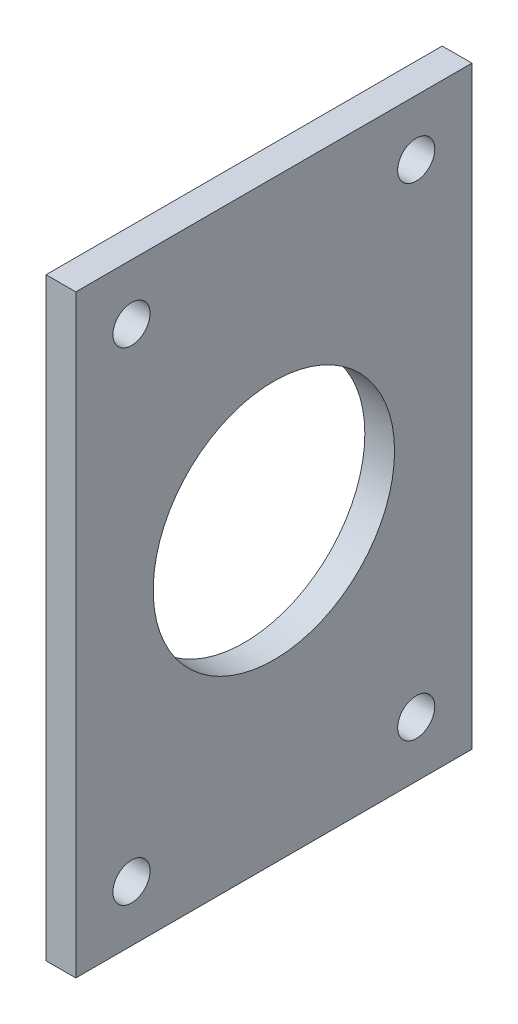
ISO-10303-21;
HEADER;
FILE_DESCRIPTION(('STEP AP214'),'2;1');
FILE_NAME('part.step','',(''),(''),'','','');
FILE_SCHEMA(('AUTOMOTIVE_DESIGN { 1 0 10303 214 1 1 1 1 }'));
ENDSEC;
DATA;
#1=APPLICATION_CONTEXT('core data for automotive mechanical design processes');
#2=APPLICATION_PROTOCOL_DEFINITION('international standard','automotive_design',2000,#1);
#3=PRODUCT_CONTEXT('',#1,'mechanical');
#4=PRODUCT('Part','Part','',(#3));
#5=PRODUCT_RELATED_PRODUCT_CATEGORY('part','',(#4));
#6=PRODUCT_DEFINITION_FORMATION('','',#4);
#7=PRODUCT_DEFINITION_CONTEXT('part definition',#1,'design');
#8=PRODUCT_DEFINITION('design','',#6,#7);
#9=PRODUCT_DEFINITION_SHAPE('','',#8);
#10=(LENGTH_UNIT() NAMED_UNIT(*) SI_UNIT(.MILLI.,.METRE.));
#11=(NAMED_UNIT(*) PLANE_ANGLE_UNIT() SI_UNIT($,.RADIAN.));
#12=(NAMED_UNIT(*) SI_UNIT($,.STERADIAN.) SOLID_ANGLE_UNIT());
#13=UNCERTAINTY_MEASURE_WITH_UNIT(LENGTH_MEASURE(1.E-05),#10,'distance_accuracy_value','');
#14=(GEOMETRIC_REPRESENTATION_CONTEXT(3) GLOBAL_UNCERTAINTY_ASSIGNED_CONTEXT((#13)) GLOBAL_UNIT_ASSIGNED_CONTEXT((#10,
#11,#12)) REPRESENTATION_CONTEXT('',''));
#15=CARTESIAN_POINT('',(0.,0.,0.));
#16=DIRECTION('',(0.,0.,1.));
#17=DIRECTION('',(1.,0.,0.));
#18=AXIS2_PLACEMENT_3D('',#15,#16,#17);
#19=CARTESIAN_POINT('',(0.,0.,16.));
#20=DIRECTION('',(0.,0.,1.));
#21=DIRECTION('',(1.,0.,0.));
#22=AXIS2_PLACEMENT_3D('',#19,#20,#21);
#23=PLANE('',#22);
#24=DIRECTION('',(-1.,0.,0.));
#25=VECTOR('',#24,1.);
#26=CARTESIAN_POINT('',(0.,-24.,16.));
#27=LINE('',#26,#25);
#28=CARTESIAN_POINT('',(1.2,-24.,16.));
#29=VERTEX_POINT('',#28);
#30=CARTESIAN_POINT('',(-1.2,-24.,16.));
#31=VERTEX_POINT('',#30);
#32=EDGE_CURVE('E293',#29,#31,#27,.T.);
#33=ORIENTED_EDGE('',*,*,#32,.F.);
#34=DIRECTION('',(0.,-1.,0.));
#35=VECTOR('',#34,1.);
#36=CARTESIAN_POINT('',(1.2,0.,16.));
#37=LINE('',#36,#35);
#38=CARTESIAN_POINT('',(1.2,24.,16.));
#39=VERTEX_POINT('',#38);
#40=EDGE_CURVE('E286',#39,#29,#37,.T.);
#41=ORIENTED_EDGE('',*,*,#40,.F.);
#42=DIRECTION('',(1.,0.,0.));
#43=VECTOR('',#42,1.);
#44=CARTESIAN_POINT('',(0.,24.,16.));
#45=LINE('',#44,#43);
#46=CARTESIAN_POINT('',(-1.2,24.,16.));
#47=VERTEX_POINT('',#46);
#48=EDGE_CURVE('E287',#47,#39,#45,.T.);
#49=ORIENTED_EDGE('',*,*,#48,.F.);
#50=DIRECTION('',(0.,1.,0.));
#51=VECTOR('',#50,1.);
#52=CARTESIAN_POINT('',(-1.2,0.,16.));
#53=LINE('',#52,#51);
#54=EDGE_CURVE('E295',#31,#47,#53,.T.);
#55=ORIENTED_EDGE('',*,*,#54,.F.);
#56=EDGE_LOOP('',(#33,#41,#49,#55));
#57=FACE_BOUND('',#56,.T.);
#58=ADVANCED_FACE('F15',(#57),#23,.T.);
#59=CARTESIAN_POINT('',(0.,-24.,-16.));
#60=DIRECTION('',(0.,-1.,0.));
#61=DIRECTION('',(0.,0.,-1.));
#62=AXIS2_PLACEMENT_3D('',#59,#60,#61);
#63=PLANE('',#62);
#64=DIRECTION('',(0.,0.,1.));
#65=VECTOR('',#64,1.);
#66=CARTESIAN_POINT('',(1.2,-24.,-16.));
#67=LINE('',#66,#65);
#68=CARTESIAN_POINT('',(1.2,-24.,-16.));
#69=VERTEX_POINT('',#68);
#70=EDGE_CURVE('E267',#69,#29,#67,.T.);
#71=ORIENTED_EDGE('',*,*,#70,.T.);
#72=ORIENTED_EDGE('',*,*,#32,.T.);
#73=DIRECTION('',(0.,0.,1.));
#74=VECTOR('',#73,1.);
#75=CARTESIAN_POINT('',(-1.2,-24.,-16.));
#76=LINE('',#75,#74);
#77=CARTESIAN_POINT('',(-1.2,-24.,-16.));
#78=VERTEX_POINT('',#77);
#79=EDGE_CURVE('E284',#78,#31,#76,.T.);
#80=ORIENTED_EDGE('',*,*,#79,.F.);
#81=DIRECTION('',(1.,0.,0.));
#82=VECTOR('',#81,1.);
#83=CARTESIAN_POINT('',(0.,-24.,-16.));
#84=LINE('',#83,#82);
#85=EDGE_CURVE('E265',#78,#69,#84,.T.);
#86=ORIENTED_EDGE('',*,*,#85,.T.);
#87=EDGE_LOOP('',(#71,#72,#80,#86));
#88=FACE_BOUND('',#87,.T.);
#89=ADVANCED_FACE('F363',(#88),#63,.T.);
#90=CARTESIAN_POINT('',(-1.2,0.,-16.));
#91=DIRECTION('',(-1.,0.,0.));
#92=DIRECTION('',(0.,0.,1.));
#93=AXIS2_PLACEMENT_3D('',#90,#91,#92);
#94=PLANE('',#93);
#95=DIRECTION('',(0.,1.,0.));
#96=VECTOR('',#95,1.);
#97=CARTESIAN_POINT('',(-1.2,0.,13.5));
#98=LINE('',#97,#96);
#99=CARTESIAN_POINT('',(-1.2,-4.,13.5));
#100=VERTEX_POINT('',#99);
#101=CARTESIAN_POINT('',(-1.2,4.,13.5));
#102=VERTEX_POINT('',#101);
#103=EDGE_CURVE('E10',#100,#102,#98,.T.);
#104=ORIENTED_EDGE('',*,*,#103,.F.);
#105=DIRECTION('',(0.,0.,1.));
#106=VECTOR('',#105,1.);
#107=CARTESIAN_POINT('',(-1.2,-4.,-16.));
#108=LINE('',#107,#106);
#109=CARTESIAN_POINT('',(-1.2,-4.,12.3));
#110=VERTEX_POINT('',#109);
#111=EDGE_CURVE('E22',#110,#100,#108,.T.);
#112=ORIENTED_EDGE('',*,*,#111,.F.);
#113=DIRECTION('',(0.,-1.,0.));
#114=VECTOR('',#113,1.);
#115=CARTESIAN_POINT('',(-1.2,0.,12.3));
#116=LINE('',#115,#114);
#117=CARTESIAN_POINT('',(-1.2,4.,12.3));
#118=VERTEX_POINT('',#117);
#119=EDGE_CURVE('E341',#118,#110,#116,.T.);
#120=ORIENTED_EDGE('',*,*,#119,.F.);
#121=DIRECTION('',(0.,0.,-1.));
#122=VECTOR('',#121,1.);
#123=CARTESIAN_POINT('',(-1.2,4.,-16.));
#124=LINE('',#123,#122);
#125=EDGE_CURVE('E32',#102,#118,#124,.T.);
#126=ORIENTED_EDGE('',*,*,#125,.F.);
#127=EDGE_LOOP('',(#104,#112,#120,#126));
#128=FACE_BOUND('',#127,.T.);
#129=DIRECTION('',(0.,1.,0.));
#130=VECTOR('',#129,1.);
#131=CARTESIAN_POINT('',(-1.2,0.,4.));
#132=LINE('',#131,#130);
#133=CARTESIAN_POINT('',(-1.2,20.3,4.));
#134=VERTEX_POINT('',#133);
#135=CARTESIAN_POINT('',(-1.2,21.5,4.));
#136=VERTEX_POINT('',#135);
#137=EDGE_CURVE('E339',#134,#136,#132,.T.);
#138=ORIENTED_EDGE('',*,*,#137,.F.);
#139=DIRECTION('',(0.,0.,1.));
#140=VECTOR('',#139,1.);
#141=CARTESIAN_POINT('',(-1.2,20.3,-16.));
#142=LINE('',#141,#140);
#143=CARTESIAN_POINT('',(-1.2,20.3,-4.));
#144=VERTEX_POINT('',#143);
#145=EDGE_CURVE('E333',#144,#134,#142,.T.);
#146=ORIENTED_EDGE('',*,*,#145,.F.);
#147=DIRECTION('',(0.,-1.,0.));
#148=VECTOR('',#147,1.);
#149=CARTESIAN_POINT('',(-1.2,0.,-4.));
#150=LINE('',#149,#148);
#151=CARTESIAN_POINT('',(-1.2,21.5,-4.));
#152=VERTEX_POINT('',#151);
#153=EDGE_CURVE('E328',#152,#144,#150,.T.);
#154=ORIENTED_EDGE('',*,*,#153,.F.);
#155=DIRECTION('',(0.,0.,-1.));
#156=VECTOR('',#155,1.);
#157=CARTESIAN_POINT('',(-1.2,21.5,-16.));
#158=LINE('',#157,#156);
#159=EDGE_CURVE('E335',#136,#152,#158,.T.);
#160=ORIENTED_EDGE('',*,*,#159,.F.);
#161=EDGE_LOOP('',(#138,#146,#154,#160));
#162=FACE_BOUND('',#161,.T.);
#163=DIRECTION('',(0.,1.,0.));
#164=VECTOR('',#163,1.);
#165=CARTESIAN_POINT('',(-1.2,0.,-12.3));
#166=LINE('',#165,#164);
#167=CARTESIAN_POINT('',(-1.2,-4.,-12.3));
#168=VERTEX_POINT('',#167);
#169=CARTESIAN_POINT('',(-1.2,4.,-12.3));
#170=VERTEX_POINT('',#169);
#171=EDGE_CURVE('E326',#168,#170,#166,.T.);
#172=ORIENTED_EDGE('',*,*,#171,.F.);
#173=DIRECTION('',(0.,0.,1.));
#174=VECTOR('',#173,1.);
#175=CARTESIAN_POINT('',(-1.2,-4.,-16.));
#176=LINE('',#175,#174);
#177=CARTESIAN_POINT('',(-1.2,-4.,-13.5));
#178=VERTEX_POINT('',#177);
#179=EDGE_CURVE('E323',#178,#168,#176,.T.);
#180=ORIENTED_EDGE('',*,*,#179,.F.);
#181=DIRECTION('',(0.,-1.,0.));
#182=VECTOR('',#181,1.);
#183=CARTESIAN_POINT('',(-1.2,0.,-13.5));
#184=LINE('',#183,#182);
#185=CARTESIAN_POINT('',(-1.2,4.,-13.5));
#186=VERTEX_POINT('',#185);
#187=EDGE_CURVE('E320',#186,#178,#184,.T.);
#188=ORIENTED_EDGE('',*,*,#187,.F.);
#189=DIRECTION('',(0.,0.,-1.));
#190=VECTOR('',#189,1.);
#191=CARTESIAN_POINT('',(-1.2,4.,-16.));
#192=LINE('',#191,#190);
#193=EDGE_CURVE('E319',#170,#186,#192,.T.);
#194=ORIENTED_EDGE('',*,*,#193,.F.);
#195=EDGE_LOOP('',(#172,#180,#188,#194));
#196=FACE_BOUND('',#195,.T.);
#197=DIRECTION('',(0.,1.,0.));
#198=VECTOR('',#197,1.);
#199=CARTESIAN_POINT('',(-1.2,0.,4.));
#200=LINE('',#199,#198);
#201=CARTESIAN_POINT('',(-1.2,-21.5,4.));
#202=VERTEX_POINT('',#201);
#203=CARTESIAN_POINT('',(-1.2,-20.3,4.));
#204=VERTEX_POINT('',#203);
#205=EDGE_CURVE('E314',#202,#204,#200,.T.);
#206=ORIENTED_EDGE('',*,*,#205,.F.);
#207=DIRECTION('',(0.,0.,1.));
#208=VECTOR('',#207,1.);
#209=CARTESIAN_POINT('',(-1.2,-21.5,-16.));
#210=LINE('',#209,#208);
#211=CARTESIAN_POINT('',(-1.2,-21.5,-4.));
#212=VERTEX_POINT('',#211);
#213=EDGE_CURVE('E313',#212,#202,#210,.T.);
#214=ORIENTED_EDGE('',*,*,#213,.F.);
#215=DIRECTION('',(0.,-1.,0.));
#216=VECTOR('',#215,1.);
#217=CARTESIAN_POINT('',(-1.2,0.,-4.));
#218=LINE('',#217,#216);
#219=CARTESIAN_POINT('',(-1.2,-20.3,-4.));
#220=VERTEX_POINT('',#219);
#221=EDGE_CURVE('E294',#220,#212,#218,.T.);
#222=ORIENTED_EDGE('',*,*,#221,.F.);
#223=DIRECTION('',(0.,0.,-1.));
#224=VECTOR('',#223,1.);
#225=CARTESIAN_POINT('',(-1.2,-20.3,-16.));
#226=LINE('',#225,#224);
#227=EDGE_CURVE('E306',#204,#220,#226,.T.);
#228=ORIENTED_EDGE('',*,*,#227,.F.);
#229=EDGE_LOOP('',(#206,#214,#222,#228));
#230=FACE_BOUND('',#229,.T.);
#231=CARTESIAN_POINT('',(-1.2,19.5,11.5));
#232=DIRECTION('',(-1.,0.,0.));
#233=DIRECTION('',(0.,0.,1.));
#234=AXIS2_PLACEMENT_3D('',#231,#232,#233);
#235=CIRCLE('',#234,1.5);
#236=CARTESIAN_POINT('',(-1.2,19.5,13.));
#237=VERTEX_POINT('',#236);
#238=EDGE_CURVE('E242',#237,#237,#235,.T.);
#239=ORIENTED_EDGE('',*,*,#238,.F.);
#240=EDGE_LOOP('',(#239));
#241=FACE_BOUND('',#240,.T.);
#242=CARTESIAN_POINT('',(-1.2,19.5,-11.5));
#243=DIRECTION('',(-1.,0.,0.));
#244=DIRECTION('',(0.,0.,1.));
#245=AXIS2_PLACEMENT_3D('',#242,#243,#244);
#246=CIRCLE('',#245,1.5);
#247=CARTESIAN_POINT('',(-1.2,19.5,-10.));
#248=VERTEX_POINT('',#247);
#249=EDGE_CURVE('E250',#248,#248,#246,.T.);
#250=ORIENTED_EDGE('',*,*,#249,.F.);
#251=EDGE_LOOP('',(#250));
#252=FACE_BOUND('',#251,.T.);
#253=CARTESIAN_POINT('',(-1.2,-19.5,11.5));
#254=DIRECTION('',(-1.,0.,0.));
#255=DIRECTION('',(0.,0.,1.));
#256=AXIS2_PLACEMENT_3D('',#253,#254,#255);
#257=CIRCLE('',#256,1.5);
#258=CARTESIAN_POINT('',(-1.2,-19.5,13.));
#259=VERTEX_POINT('',#258);
#260=EDGE_CURVE('E253',#259,#259,#257,.T.);
#261=ORIENTED_EDGE('',*,*,#260,.F.);
#262=EDGE_LOOP('',(#261));
#263=FACE_BOUND('',#262,.T.);
#264=CARTESIAN_POINT('',(-1.2,-19.5,-11.5));
#265=DIRECTION('',(-1.,0.,0.));
#266=DIRECTION('',(0.,0.,1.));
#267=AXIS2_PLACEMENT_3D('',#264,#265,#266);
#268=CIRCLE('',#267,1.5);
#269=CARTESIAN_POINT('',(-1.2,-19.5,-10.));
#270=VERTEX_POINT('',#269);
#271=EDGE_CURVE('E254',#270,#270,#268,.T.);
#272=ORIENTED_EDGE('',*,*,#271,.F.);
#273=EDGE_LOOP('',(#272));
#274=FACE_BOUND('',#273,.T.);
#275=CARTESIAN_POINT('',(-1.2,0.,0.));
#276=DIRECTION('',(-1.,0.,0.));
#277=DIRECTION('',(0.,0.,1.));
#278=AXIS2_PLACEMENT_3D('',#275,#276,#277);
#279=CIRCLE('',#278,9.75);
#280=CARTESIAN_POINT('',(-1.2,0.,9.75));
#281=VERTEX_POINT('',#280);
#282=EDGE_CURVE('E259',#281,#281,#279,.T.);
#283=ORIENTED_EDGE('',*,*,#282,.F.);
#284=EDGE_LOOP('',(#283));
#285=FACE_BOUND('',#284,.T.);
#286=ORIENTED_EDGE('',*,*,#79,.T.);
#287=ORIENTED_EDGE('',*,*,#54,.T.);
#288=DIRECTION('',(0.,0.,1.));
#289=VECTOR('',#288,1.);
#290=CARTESIAN_POINT('',(-1.2,24.,-16.));
#291=LINE('',#290,#289);
#292=CARTESIAN_POINT('',(-1.2,24.,-16.));
#293=VERTEX_POINT('',#292);
#294=EDGE_CURVE('E278',#293,#47,#291,.T.);
#295=ORIENTED_EDGE('',*,*,#294,.F.);
#296=DIRECTION('',(0.,-1.,0.));
#297=VECTOR('',#296,1.);
#298=CARTESIAN_POINT('',(-1.2,0.,-16.));
#299=LINE('',#298,#297);
#300=EDGE_CURVE('E264',#293,#78,#299,.T.);
#301=ORIENTED_EDGE('',*,*,#300,.T.);
#302=EDGE_LOOP('',(#286,#287,#295,#301));
#303=FACE_BOUND('',#302,.T.);
#304=ADVANCED_FACE('F368',(#128,#162,#196,#230,#241,#252,#263,#274,#285,#303),#94,.T.);
#305=CARTESIAN_POINT('',(0.,24.,-16.));
#306=DIRECTION('',(0.,1.,0.));
#307=DIRECTION('',(0.,0.,1.));
#308=AXIS2_PLACEMENT_3D('',#305,#306,#307);
#309=PLANE('',#308);
#310=ORIENTED_EDGE('',*,*,#294,.T.);
#311=ORIENTED_EDGE('',*,*,#48,.T.);
#312=DIRECTION('',(0.,0.,1.));
#313=VECTOR('',#312,1.);
#314=CARTESIAN_POINT('',(1.2,24.,-16.));
#315=LINE('',#314,#313);
#316=CARTESIAN_POINT('',(1.2,24.,-16.));
#317=VERTEX_POINT('',#316);
#318=EDGE_CURVE('E280',#317,#39,#315,.T.);
#319=ORIENTED_EDGE('',*,*,#318,.F.);
#320=DIRECTION('',(-1.,0.,0.));
#321=VECTOR('',#320,1.);
#322=CARTESIAN_POINT('',(0.,24.,-16.));
#323=LINE('',#322,#321);
#324=EDGE_CURVE('E269',#317,#293,#323,.T.);
#325=ORIENTED_EDGE('',*,*,#324,.T.);
#326=EDGE_LOOP('',(#310,#311,#319,#325));
#327=FACE_BOUND('',#326,.T.);
#328=ADVANCED_FACE('F379',(#327),#309,.T.);
#329=CARTESIAN_POINT('',(0.,0.,-16.));
#330=DIRECTION('',(0.,0.,-1.));
#331=DIRECTION('',(-1.,0.,0.));
#332=AXIS2_PLACEMENT_3D('',#329,#330,#331);
#333=PLANE('',#332);
#334=DIRECTION('',(0.,1.,0.));
#335=VECTOR('',#334,1.);
#336=CARTESIAN_POINT('',(1.2,0.,-16.));
#337=LINE('',#336,#335);
#338=EDGE_CURVE('E266',#69,#317,#337,.T.);
#339=ORIENTED_EDGE('',*,*,#338,.F.);
#340=ORIENTED_EDGE('',*,*,#85,.F.);
#341=ORIENTED_EDGE('',*,*,#300,.F.);
#342=ORIENTED_EDGE('',*,*,#324,.F.);
#343=EDGE_LOOP('',(#339,#340,#341,#342));
#344=FACE_BOUND('',#343,.T.);
#345=ADVANCED_FACE('F378',(#344),#333,.T.);
#346=CARTESIAN_POINT('',(1.2,0.,-16.));
#347=DIRECTION('',(1.,0.,0.));
#348=DIRECTION('',(0.,0.,-1.));
#349=AXIS2_PLACEMENT_3D('',#346,#347,#348);
#350=PLANE('',#349);
#351=CARTESIAN_POINT('',(1.2,19.5,11.5));
#352=DIRECTION('',(1.,0.,0.));
#353=DIRECTION('',(0.,0.,-1.));
#354=AXIS2_PLACEMENT_3D('',#351,#352,#353);
#355=CIRCLE('',#354,1.5);
#356=CARTESIAN_POINT('',(1.2,19.5,10.));
#357=VERTEX_POINT('',#356);
#358=EDGE_CURVE('E245',#357,#357,#355,.T.);
#359=ORIENTED_EDGE('',*,*,#358,.F.);
#360=EDGE_LOOP('',(#359));
#361=FACE_BOUND('',#360,.T.);
#362=CARTESIAN_POINT('',(1.2,19.5,-11.5));
#363=DIRECTION('',(1.,0.,0.));
#364=DIRECTION('',(0.,0.,-1.));
#365=AXIS2_PLACEMENT_3D('',#362,#363,#364);
#366=CIRCLE('',#365,1.5);
#367=CARTESIAN_POINT('',(1.2,19.5,-13.));
#368=VERTEX_POINT('',#367);
#369=EDGE_CURVE('E246',#368,#368,#366,.T.);
#370=ORIENTED_EDGE('',*,*,#369,.F.);
#371=EDGE_LOOP('',(#370));
#372=FACE_BOUND('',#371,.T.);
#373=CARTESIAN_POINT('',(1.2,-19.5,11.5));
#374=DIRECTION('',(1.,0.,0.));
#375=DIRECTION('',(0.,0.,-1.));
#376=AXIS2_PLACEMENT_3D('',#373,#374,#375);
#377=CIRCLE('',#376,1.5);
#378=CARTESIAN_POINT('',(1.2,-19.5,10.));
#379=VERTEX_POINT('',#378);
#380=EDGE_CURVE('E249',#379,#379,#377,.T.);
#381=ORIENTED_EDGE('',*,*,#380,.F.);
#382=EDGE_LOOP('',(#381));
#383=FACE_BOUND('',#382,.T.);
#384=CARTESIAN_POINT('',(1.2,-19.5,-11.5));
#385=DIRECTION('',(1.,0.,0.));
#386=DIRECTION('',(0.,0.,-1.));
#387=AXIS2_PLACEMENT_3D('',#384,#385,#386);
#388=CIRCLE('',#387,1.5);
#389=CARTESIAN_POINT('',(1.2,-19.5,-13.));
#390=VERTEX_POINT('',#389);
#391=EDGE_CURVE('E255',#390,#390,#388,.T.);
#392=ORIENTED_EDGE('',*,*,#391,.F.);
#393=EDGE_LOOP('',(#392));
#394=FACE_BOUND('',#393,.T.);
#395=CARTESIAN_POINT('',(1.2,0.,0.));
#396=DIRECTION('',(1.,0.,0.));
#397=DIRECTION('',(0.,0.,-1.));
#398=AXIS2_PLACEMENT_3D('',#395,#396,#397);
#399=CIRCLE('',#398,9.75);
#400=CARTESIAN_POINT('',(1.2,0.,-9.75));
#401=VERTEX_POINT('',#400);
#402=EDGE_CURVE('E256',#401,#401,#399,.T.);
#403=ORIENTED_EDGE('',*,*,#402,.F.);
#404=EDGE_LOOP('',(#403));
#405=FACE_BOUND('',#404,.T.);
#406=ORIENTED_EDGE('',*,*,#338,.T.);
#407=ORIENTED_EDGE('',*,*,#318,.T.);
#408=ORIENTED_EDGE('',*,*,#40,.T.);
#409=ORIENTED_EDGE('',*,*,#70,.F.);
#410=EDGE_LOOP('',(#406,#407,#408,#409));
#411=FACE_BOUND('',#410,.T.);
#412=ADVANCED_FACE('F375',(#361,#372,#383,#394,#405,#411),#350,.T.);
#413=CARTESIAN_POINT('',(-2.2,0.,0.));
#414=DIRECTION('',(1.,0.,0.));
#415=DIRECTION('',(0.,0.,-1.));
#416=AXIS2_PLACEMENT_3D('',#413,#414,#415);
#417=CYLINDRICAL_SURFACE('',#416,9.75);
#418=ORIENTED_EDGE('',*,*,#282,.T.);
#419=EDGE_LOOP('',(#418));
#420=FACE_BOUND('',#419,.T.);
#421=ORIENTED_EDGE('',*,*,#402,.T.);
#422=EDGE_LOOP('',(#421));
#423=FACE_BOUND('',#422,.T.);
#424=ADVANCED_FACE('F392',(#420,#423),#417,.F.);
#425=CARTESIAN_POINT('',(-2.2,-19.5,-11.5));
#426=DIRECTION('',(1.,0.,0.));
#427=DIRECTION('',(0.,0.,-1.));
#428=AXIS2_PLACEMENT_3D('',#425,#426,#427);
#429=CYLINDRICAL_SURFACE('',#428,1.5);
#430=ORIENTED_EDGE('',*,*,#271,.T.);
#431=EDGE_LOOP('',(#430));
#432=FACE_BOUND('',#431,.T.);
#433=ORIENTED_EDGE('',*,*,#391,.T.);
#434=EDGE_LOOP('',(#433));
#435=FACE_BOUND('',#434,.T.);
#436=ADVANCED_FACE('F398',(#432,#435),#429,.F.);
#437=CARTESIAN_POINT('',(-2.2,-19.5,11.5));
#438=DIRECTION('',(1.,0.,0.));
#439=DIRECTION('',(0.,0.,-1.));
#440=AXIS2_PLACEMENT_3D('',#437,#438,#439);
#441=CYLINDRICAL_SURFACE('',#440,1.5);
#442=ORIENTED_EDGE('',*,*,#260,.T.);
#443=EDGE_LOOP('',(#442));
#444=FACE_BOUND('',#443,.T.);
#445=ORIENTED_EDGE('',*,*,#380,.T.);
#446=EDGE_LOOP('',(#445));
#447=FACE_BOUND('',#446,.T.);
#448=ADVANCED_FACE('F401',(#444,#447),#441,.F.);
#449=CARTESIAN_POINT('',(-2.2,19.5,-11.5));
#450=DIRECTION('',(1.,0.,0.));
#451=DIRECTION('',(0.,0.,-1.));
#452=AXIS2_PLACEMENT_3D('',#449,#450,#451);
#453=CYLINDRICAL_SURFACE('',#452,1.5);
#454=ORIENTED_EDGE('',*,*,#249,.T.);
#455=EDGE_LOOP('',(#454));
#456=FACE_BOUND('',#455,.T.);
#457=ORIENTED_EDGE('',*,*,#369,.T.);
#458=EDGE_LOOP('',(#457));
#459=FACE_BOUND('',#458,.T.);
#460=ADVANCED_FACE('F406',(#456,#459),#453,.F.);
#461=CARTESIAN_POINT('',(-2.2,19.5,11.5));
#462=DIRECTION('',(1.,0.,0.));
#463=DIRECTION('',(0.,0.,-1.));
#464=AXIS2_PLACEMENT_3D('',#461,#462,#463);
#465=CYLINDRICAL_SURFACE('',#464,1.5);
#466=ORIENTED_EDGE('',*,*,#238,.T.);
#467=EDGE_LOOP('',(#466));
#468=FACE_BOUND('',#467,.T.);
#469=ORIENTED_EDGE('',*,*,#358,.T.);
#470=EDGE_LOOP('',(#469));
#471=FACE_BOUND('',#470,.T.);
#472=ADVANCED_FACE('F409',(#468,#471),#465,.F.);
#473=CARTESIAN_POINT('',(-2.1,-20.9,4.));
#474=DIRECTION('',(0.,0.,1.));
#475=DIRECTION('',(1.,0.,0.));
#476=AXIS2_PLACEMENT_3D('',#473,#474,#475);
#477=PLANE('',#476);
#478=DIRECTION('',(-1.,0.,0.));
#479=VECTOR('',#478,1.);
#480=CARTESIAN_POINT('',(-2.1,-21.5,4.));
#481=LINE('',#480,#479);
#482=CARTESIAN_POINT('',(-3.2,-21.5,4.));
#483=VERTEX_POINT('',#482);
#484=EDGE_CURVE('E239',#202,#483,#481,.T.);
#485=ORIENTED_EDGE('',*,*,#484,.F.);
#486=ORIENTED_EDGE('',*,*,#205,.T.);
#487=DIRECTION('',(1.,0.,0.));
#488=VECTOR('',#487,1.);
#489=CARTESIAN_POINT('',(-2.1,-20.3,4.));
#490=LINE('',#489,#488);
#491=CARTESIAN_POINT('',(-3.2,-20.3,4.));
#492=VERTEX_POINT('',#491);
#493=EDGE_CURVE('E234',#492,#204,#490,.T.);
#494=ORIENTED_EDGE('',*,*,#493,.F.);
#495=DIRECTION('',(0.,1.,0.));
#496=VECTOR('',#495,1.);
#497=CARTESIAN_POINT('',(-3.2,-20.9,4.));
#498=LINE('',#497,#496);
#499=EDGE_CURVE('E238',#483,#492,#498,.T.);
#500=ORIENTED_EDGE('',*,*,#499,.F.);
#501=EDGE_LOOP('',(#485,#486,#494,#500));
#502=FACE_BOUND('',#501,.T.);
#503=ADVANCED_FACE('F412',(#502),#477,.T.);
#504=CARTESIAN_POINT('',(-2.1,-21.5,-4.));
#505=DIRECTION('',(0.,-1.,0.));
#506=DIRECTION('',(0.,0.,-1.));
#507=AXIS2_PLACEMENT_3D('',#504,#505,#506);
#508=PLANE('',#507);
#509=DIRECTION('',(1.,0.,0.));
#510=VECTOR('',#509,1.);
#511=CARTESIAN_POINT('',(-2.1,-21.5,-4.));
#512=LINE('',#511,#510);
#513=CARTESIAN_POINT('',(-3.2,-21.5,-4.));
#514=VERTEX_POINT('',#513);
#515=EDGE_CURVE('E222',#514,#212,#512,.T.);
#516=ORIENTED_EDGE('',*,*,#515,.T.);
#517=ORIENTED_EDGE('',*,*,#213,.T.);
#518=ORIENTED_EDGE('',*,*,#484,.T.);
#519=DIRECTION('',(0.,0.,1.));
#520=VECTOR('',#519,1.);
#521=CARTESIAN_POINT('',(-3.2,-21.5,-4.));
#522=LINE('',#521,#520);
#523=EDGE_CURVE('E235',#514,#483,#522,.T.);
#524=ORIENTED_EDGE('',*,*,#523,.F.);
#525=EDGE_LOOP('',(#516,#517,#518,#524));
#526=FACE_BOUND('',#525,.T.);
#527=ADVANCED_FACE('F416',(#526),#508,.T.);
#528=CARTESIAN_POINT('',(-3.2,-20.9,-4.));
#529=DIRECTION('',(-1.,0.,0.));
#530=DIRECTION('',(0.,0.,1.));
#531=AXIS2_PLACEMENT_3D('',#528,#529,#530);
#532=PLANE('',#531);
#533=ORIENTED_EDGE('',*,*,#523,.T.);
#534=ORIENTED_EDGE('',*,*,#499,.T.);
#535=DIRECTION('',(0.,0.,1.));
#536=VECTOR('',#535,1.);
#537=CARTESIAN_POINT('',(-3.2,-20.3,-4.));
#538=LINE('',#537,#536);
#539=CARTESIAN_POINT('',(-3.2,-20.3,-4.));
#540=VERTEX_POINT('',#539);
#541=EDGE_CURVE('E227',#540,#492,#538,.T.);
#542=ORIENTED_EDGE('',*,*,#541,.F.);
#543=DIRECTION('',(0.,-1.,0.));
#544=VECTOR('',#543,1.);
#545=CARTESIAN_POINT('',(-3.2,-20.9,-4.));
#546=LINE('',#545,#544);
#547=EDGE_CURVE('E221',#540,#514,#546,.T.);
#548=ORIENTED_EDGE('',*,*,#547,.T.);
#549=EDGE_LOOP('',(#533,#534,#542,#548));
#550=FACE_BOUND('',#549,.T.);
#551=ADVANCED_FACE('F425',(#550),#532,.T.);
#552=CARTESIAN_POINT('',(-2.1,-20.3,-4.));
#553=DIRECTION('',(0.,1.,0.));
#554=DIRECTION('',(0.,0.,1.));
#555=AXIS2_PLACEMENT_3D('',#552,#553,#554);
#556=PLANE('',#555);
#557=ORIENTED_EDGE('',*,*,#493,.T.);
#558=ORIENTED_EDGE('',*,*,#227,.T.);
#559=DIRECTION('',(-1.,0.,0.));
#560=VECTOR('',#559,1.);
#561=CARTESIAN_POINT('',(-2.1,-20.3,-4.));
#562=LINE('',#561,#560);
#563=EDGE_CURVE('E223',#220,#540,#562,.T.);
#564=ORIENTED_EDGE('',*,*,#563,.T.);
#565=ORIENTED_EDGE('',*,*,#541,.T.);
#566=EDGE_LOOP('',(#557,#558,#564,#565));
#567=FACE_BOUND('',#566,.T.);
#568=ADVANCED_FACE('F426',(#567),#556,.T.);
#569=CARTESIAN_POINT('',(-2.1,-20.9,-4.));
#570=DIRECTION('',(0.,0.,-1.));
#571=DIRECTION('',(-1.,0.,0.));
#572=AXIS2_PLACEMENT_3D('',#569,#570,#571);
#573=PLANE('',#572);
#574=ORIENTED_EDGE('',*,*,#563,.F.);
#575=ORIENTED_EDGE('',*,*,#221,.T.);
#576=ORIENTED_EDGE('',*,*,#515,.F.);
#577=ORIENTED_EDGE('',*,*,#547,.F.);
#578=EDGE_LOOP('',(#574,#575,#576,#577));
#579=FACE_BOUND('',#578,.T.);
#580=ADVANCED_FACE('F429',(#579),#573,.T.);
#581=CARTESIAN_POINT('',(-2.1,0.,-12.3));
#582=DIRECTION('',(0.,0.,1.));
#583=DIRECTION('',(1.,0.,0.));
#584=AXIS2_PLACEMENT_3D('',#581,#582,#583);
#585=PLANE('',#584);
#586=DIRECTION('',(-1.,0.,0.));
#587=VECTOR('',#586,1.);
#588=CARTESIAN_POINT('',(-2.1,-4.,-12.3));
#589=LINE('',#588,#587);
#590=CARTESIAN_POINT('',(-3.2,-4.,-12.3));
#591=VERTEX_POINT('',#590);
#592=EDGE_CURVE('E218',#168,#591,#589,.T.);
#593=ORIENTED_EDGE('',*,*,#592,.F.);
#594=ORIENTED_EDGE('',*,*,#171,.T.);
#595=DIRECTION('',(1.,0.,0.));
#596=VECTOR('',#595,1.);
#597=CARTESIAN_POINT('',(-2.1,4.,-12.3));
#598=LINE('',#597,#596);
#599=CARTESIAN_POINT('',(-3.2,4.,-12.3));
#600=VERTEX_POINT('',#599);
#601=EDGE_CURVE('E212',#600,#170,#598,.T.);
#602=ORIENTED_EDGE('',*,*,#601,.F.);
#603=DIRECTION('',(0.,1.,0.));
#604=VECTOR('',#603,1.);
#605=CARTESIAN_POINT('',(-3.2,0.,-12.3));
#606=LINE('',#605,#604);
#607=EDGE_CURVE('E220',#591,#600,#606,.T.);
#608=ORIENTED_EDGE('',*,*,#607,.F.);
#609=EDGE_LOOP('',(#593,#594,#602,#608));
#610=FACE_BOUND('',#609,.T.);
#611=ADVANCED_FACE('F432',(#610),#585,.T.);
#612=CARTESIAN_POINT('',(-2.1,-4.,-13.5));
#613=DIRECTION('',(0.,-1.,0.));
#614=DIRECTION('',(0.,0.,-1.));
#615=AXIS2_PLACEMENT_3D('',#612,#613,#614);
#616=PLANE('',#615);
#617=DIRECTION('',(1.,0.,0.));
#618=VECTOR('',#617,1.);
#619=CARTESIAN_POINT('',(-2.1,-4.,-13.5));
#620=LINE('',#619,#618);
#621=CARTESIAN_POINT('',(-3.2,-4.,-13.5));
#622=VERTEX_POINT('',#621);
#623=EDGE_CURVE('E199',#622,#178,#620,.T.);
#624=ORIENTED_EDGE('',*,*,#623,.T.);
#625=ORIENTED_EDGE('',*,*,#179,.T.);
#626=ORIENTED_EDGE('',*,*,#592,.T.);
#627=DIRECTION('',(0.,0.,1.));
#628=VECTOR('',#627,1.);
#629=CARTESIAN_POINT('',(-3.2,-4.,-13.5));
#630=LINE('',#629,#628);
#631=EDGE_CURVE('E211',#622,#591,#630,.T.);
#632=ORIENTED_EDGE('',*,*,#631,.F.);
#633=EDGE_LOOP('',(#624,#625,#626,#632));
#634=FACE_BOUND('',#633,.T.);
#635=ADVANCED_FACE('F437',(#634),#616,.T.);
#636=CARTESIAN_POINT('',(-3.2,0.,-13.5));
#637=DIRECTION('',(-1.,0.,0.));
#638=DIRECTION('',(0.,0.,1.));
#639=AXIS2_PLACEMENT_3D('',#636,#637,#638);
#640=PLANE('',#639);
#641=ORIENTED_EDGE('',*,*,#631,.T.);
#642=ORIENTED_EDGE('',*,*,#607,.T.);
#643=DIRECTION('',(0.,0.,1.));
#644=VECTOR('',#643,1.);
#645=CARTESIAN_POINT('',(-3.2,4.,-13.5));
#646=LINE('',#645,#644);
#647=CARTESIAN_POINT('',(-3.2,4.,-13.5));
#648=VERTEX_POINT('',#647);
#649=EDGE_CURVE('E206',#648,#600,#646,.T.);
#650=ORIENTED_EDGE('',*,*,#649,.F.);
#651=DIRECTION('',(0.,-1.,0.));
#652=VECTOR('',#651,1.);
#653=CARTESIAN_POINT('',(-3.2,0.,-13.5));
#654=LINE('',#653,#652);
#655=EDGE_CURVE('E201',#648,#622,#654,.T.);
#656=ORIENTED_EDGE('',*,*,#655,.T.);
#657=EDGE_LOOP('',(#641,#642,#650,#656));
#658=FACE_BOUND('',#657,.T.);
#659=ADVANCED_FACE('F445',(#658),#640,.T.);
#660=CARTESIAN_POINT('',(-2.1,4.,-13.5));
#661=DIRECTION('',(0.,1.,0.));
#662=DIRECTION('',(0.,0.,1.));
#663=AXIS2_PLACEMENT_3D('',#660,#661,#662);
#664=PLANE('',#663);
#665=ORIENTED_EDGE('',*,*,#601,.T.);
#666=ORIENTED_EDGE('',*,*,#193,.T.);
#667=DIRECTION('',(-1.,0.,0.));
#668=VECTOR('',#667,1.);
#669=CARTESIAN_POINT('',(-2.1,4.,-13.5));
#670=LINE('',#669,#668);
#671=EDGE_CURVE('E204',#186,#648,#670,.T.);
#672=ORIENTED_EDGE('',*,*,#671,.T.);
#673=ORIENTED_EDGE('',*,*,#649,.T.);
#674=EDGE_LOOP('',(#665,#666,#672,#673));
#675=FACE_BOUND('',#674,.T.);
#676=ADVANCED_FACE('F446',(#675),#664,.T.);
#677=CARTESIAN_POINT('',(-2.1,0.,-13.5));
#678=DIRECTION('',(0.,0.,-1.));
#679=DIRECTION('',(-1.,0.,0.));
#680=AXIS2_PLACEMENT_3D('',#677,#678,#679);
#681=PLANE('',#680);
#682=ORIENTED_EDGE('',*,*,#671,.F.);
#683=ORIENTED_EDGE('',*,*,#187,.T.);
#684=ORIENTED_EDGE('',*,*,#623,.F.);
#685=ORIENTED_EDGE('',*,*,#655,.F.);
#686=EDGE_LOOP('',(#682,#683,#684,#685));
#687=FACE_BOUND('',#686,.T.);
#688=ADVANCED_FACE('F450',(#687),#681,.T.);
#689=CARTESIAN_POINT('',(-2.1,20.9,4.));
#690=DIRECTION('',(0.,0.,1.));
#691=DIRECTION('',(1.,0.,0.));
#692=AXIS2_PLACEMENT_3D('',#689,#690,#691);
#693=PLANE('',#692);
#694=DIRECTION('',(-1.,0.,0.));
#695=VECTOR('',#694,1.);
#696=CARTESIAN_POINT('',(-2.1,20.3,4.));
#697=LINE('',#696,#695);
#698=CARTESIAN_POINT('',(-3.2,20.3,4.));
#699=VERTEX_POINT('',#698);
#700=EDGE_CURVE('E196',#134,#699,#697,.T.);
#701=ORIENTED_EDGE('',*,*,#700,.F.);
#702=ORIENTED_EDGE('',*,*,#137,.T.);
#703=DIRECTION('',(1.,0.,0.));
#704=VECTOR('',#703,1.);
#705=CARTESIAN_POINT('',(-2.1,21.5,4.));
#706=LINE('',#705,#704);
#707=CARTESIAN_POINT('',(-3.2,21.5,4.));
#708=VERTEX_POINT('',#707);
#709=EDGE_CURVE('E193',#708,#136,#706,.T.);
#710=ORIENTED_EDGE('',*,*,#709,.F.);
#711=DIRECTION('',(0.,1.,0.));
#712=VECTOR('',#711,1.);
#713=CARTESIAN_POINT('',(-3.2,20.9,4.));
#714=LINE('',#713,#712);
#715=EDGE_CURVE('E198',#699,#708,#714,.T.);
#716=ORIENTED_EDGE('',*,*,#715,.F.);
#717=EDGE_LOOP('',(#701,#702,#710,#716));
#718=FACE_BOUND('',#717,.T.);
#719=ADVANCED_FACE('F452',(#718),#693,.T.);
#720=CARTESIAN_POINT('',(-2.1,20.3,-4.));
#721=DIRECTION('',(0.,-1.,0.));
#722=DIRECTION('',(0.,0.,-1.));
#723=AXIS2_PLACEMENT_3D('',#720,#721,#722);
#724=PLANE('',#723);
#725=DIRECTION('',(1.,0.,0.));
#726=VECTOR('',#725,1.);
#727=CARTESIAN_POINT('',(-2.1,20.3,-4.));
#728=LINE('',#727,#726);
#729=CARTESIAN_POINT('',(-3.2,20.3,-4.));
#730=VERTEX_POINT('',#729);
#731=EDGE_CURVE('E177',#730,#144,#728,.T.);
#732=ORIENTED_EDGE('',*,*,#731,.T.);
#733=ORIENTED_EDGE('',*,*,#145,.T.);
#734=ORIENTED_EDGE('',*,*,#700,.T.);
#735=DIRECTION('',(0.,0.,1.));
#736=VECTOR('',#735,1.);
#737=CARTESIAN_POINT('',(-3.2,20.3,-4.));
#738=LINE('',#737,#736);
#739=EDGE_CURVE('E189',#730,#699,#738,.T.);
#740=ORIENTED_EDGE('',*,*,#739,.F.);
#741=EDGE_LOOP('',(#732,#733,#734,#740));
#742=FACE_BOUND('',#741,.T.);
#743=ADVANCED_FACE('F458',(#742),#724,.T.);
#744=CARTESIAN_POINT('',(-3.2,20.9,-4.));
#745=DIRECTION('',(-1.,0.,0.));
#746=DIRECTION('',(0.,0.,1.));
#747=AXIS2_PLACEMENT_3D('',#744,#745,#746);
#748=PLANE('',#747);
#749=ORIENTED_EDGE('',*,*,#739,.T.);
#750=ORIENTED_EDGE('',*,*,#715,.T.);
#751=DIRECTION('',(0.,0.,1.));
#752=VECTOR('',#751,1.);
#753=CARTESIAN_POINT('',(-3.2,21.5,-4.));
#754=LINE('',#753,#752);
#755=CARTESIAN_POINT('',(-3.2,21.5,-4.));
#756=VERTEX_POINT('',#755);
#757=EDGE_CURVE('E184',#756,#708,#754,.T.);
#758=ORIENTED_EDGE('',*,*,#757,.F.);
#759=DIRECTION('',(0.,-1.,0.));
#760=VECTOR('',#759,1.);
#761=CARTESIAN_POINT('',(-3.2,20.9,-4.));
#762=LINE('',#761,#760);
#763=EDGE_CURVE('E181',#756,#730,#762,.T.);
#764=ORIENTED_EDGE('',*,*,#763,.T.);
#765=EDGE_LOOP('',(#749,#750,#758,#764));
#766=FACE_BOUND('',#765,.T.);
#767=ADVANCED_FACE('F465',(#766),#748,.T.);
#768=CARTESIAN_POINT('',(-2.1,21.5,-4.));
#769=DIRECTION('',(0.,1.,0.));
#770=DIRECTION('',(0.,0.,1.));
#771=AXIS2_PLACEMENT_3D('',#768,#769,#770);
#772=PLANE('',#771);
#773=ORIENTED_EDGE('',*,*,#709,.T.);
#774=ORIENTED_EDGE('',*,*,#159,.T.);
#775=DIRECTION('',(-1.,0.,0.));
#776=VECTOR('',#775,1.);
#777=CARTESIAN_POINT('',(-2.1,21.5,-4.));
#778=LINE('',#777,#776);
#779=EDGE_CURVE('E183',#152,#756,#778,.T.);
#780=ORIENTED_EDGE('',*,*,#779,.T.);
#781=ORIENTED_EDGE('',*,*,#757,.T.);
#782=EDGE_LOOP('',(#773,#774,#780,#781));
#783=FACE_BOUND('',#782,.T.);
#784=ADVANCED_FACE('F360',(#783),#772,.T.);
#785=CARTESIAN_POINT('',(-2.1,20.9,-4.));
#786=DIRECTION('',(0.,0.,-1.));
#787=DIRECTION('',(-1.,0.,0.));
#788=AXIS2_PLACEMENT_3D('',#785,#786,#787);
#789=PLANE('',#788);
#790=ORIENTED_EDGE('',*,*,#779,.F.);
#791=ORIENTED_EDGE('',*,*,#153,.T.);
#792=ORIENTED_EDGE('',*,*,#731,.F.);
#793=ORIENTED_EDGE('',*,*,#763,.F.);
#794=EDGE_LOOP('',(#790,#791,#792,#793));
#795=FACE_BOUND('',#794,.T.);
#796=ADVANCED_FACE('F347',(#795),#789,.T.);
#797=CARTESIAN_POINT('',(-2.1,0.,13.5));
#798=DIRECTION('',(0.,0.,1.));
#799=DIRECTION('',(1.,0.,0.));
#800=AXIS2_PLACEMENT_3D('',#797,#798,#799);
#801=PLANE('',#800);
#802=DIRECTION('',(-1.,0.,0.));
#803=VECTOR('',#802,1.);
#804=CARTESIAN_POINT('',(-2.1,-4.,13.5));
#805=LINE('',#804,#803);
#806=CARTESIAN_POINT('',(-3.2,-4.,13.5));
#807=VERTEX_POINT('',#806);
#808=EDGE_CURVE('E180',#100,#807,#805,.T.);
#809=ORIENTED_EDGE('',*,*,#808,.F.);
#810=ORIENTED_EDGE('',*,*,#103,.T.);
#811=DIRECTION('',(1.,0.,0.));
#812=VECTOR('',#811,1.);
#813=CARTESIAN_POINT('',(-2.1,4.,13.5));
#814=LINE('',#813,#812);
#815=CARTESIAN_POINT('',(-3.2,4.,13.5));
#816=VERTEX_POINT('',#815);
#817=EDGE_CURVE('E173',#816,#102,#814,.T.);
#818=ORIENTED_EDGE('',*,*,#817,.F.);
#819=DIRECTION('',(0.,1.,0.));
#820=VECTOR('',#819,1.);
#821=CARTESIAN_POINT('',(-3.2,0.,13.5));
#822=LINE('',#821,#820);
#823=EDGE_CURVE('E162',#807,#816,#822,.T.);
#824=ORIENTED_EDGE('',*,*,#823,.F.);
#825=EDGE_LOOP('',(#809,#810,#818,#824));
#826=FACE_BOUND('',#825,.T.);
#827=ADVANCED_FACE('F346',(#826),#801,.T.);
#828=CARTESIAN_POINT('',(-2.1,-4.,12.3));
#829=DIRECTION('',(0.,-1.,0.));
#830=DIRECTION('',(0.,0.,-1.));
#831=AXIS2_PLACEMENT_3D('',#828,#829,#830);
#832=PLANE('',#831);
#833=DIRECTION('',(1.,0.,0.));
#834=VECTOR('',#833,1.);
#835=CARTESIAN_POINT('',(-2.1,-4.,12.3));
#836=LINE('',#835,#834);
#837=CARTESIAN_POINT('',(-3.2,-4.,12.3));
#838=VERTEX_POINT('',#837);
#839=EDGE_CURVE('E166',#838,#110,#836,.T.);
#840=ORIENTED_EDGE('',*,*,#839,.T.);
#841=ORIENTED_EDGE('',*,*,#111,.T.);
#842=ORIENTED_EDGE('',*,*,#808,.T.);
#843=DIRECTION('',(0.,0.,1.));
#844=VECTOR('',#843,1.);
#845=CARTESIAN_POINT('',(-3.2,-4.,12.3));
#846=LINE('',#845,#844);
#847=EDGE_CURVE('E164',#838,#807,#846,.T.);
#848=ORIENTED_EDGE('',*,*,#847,.F.);
#849=EDGE_LOOP('',(#840,#841,#842,#848));
#850=FACE_BOUND('',#849,.T.);
#851=ADVANCED_FACE('F344',(#850),#832,.T.);
#852=CARTESIAN_POINT('',(-3.2,0.,12.3));
#853=DIRECTION('',(-1.,0.,0.));
#854=DIRECTION('',(0.,0.,1.));
#855=AXIS2_PLACEMENT_3D('',#852,#853,#854);
#856=PLANE('',#855);
#857=ORIENTED_EDGE('',*,*,#847,.T.);
#858=ORIENTED_EDGE('',*,*,#823,.T.);
#859=DIRECTION('',(0.,0.,1.));
#860=VECTOR('',#859,1.);
#861=CARTESIAN_POINT('',(-3.2,4.,12.3));
#862=LINE('',#861,#860);
#863=CARTESIAN_POINT('',(-3.2,4.,12.3));
#864=VERTEX_POINT('',#863);
#865=EDGE_CURVE('E151',#864,#816,#862,.T.);
#866=ORIENTED_EDGE('',*,*,#865,.F.);
#867=DIRECTION('',(0.,-1.,0.));
#868=VECTOR('',#867,1.);
#869=CARTESIAN_POINT('',(-3.2,0.,12.3));
#870=LINE('',#869,#868);
#871=EDGE_CURVE('E154',#864,#838,#870,.T.);
#872=ORIENTED_EDGE('',*,*,#871,.T.);
#873=EDGE_LOOP('',(#857,#858,#866,#872));
#874=FACE_BOUND('',#873,.T.);
#875=ADVANCED_FACE('F159',(#874),#856,.T.);
#876=CARTESIAN_POINT('',(-2.1,4.,12.3));
#877=DIRECTION('',(0.,1.,0.));
#878=DIRECTION('',(0.,0.,1.));
#879=AXIS2_PLACEMENT_3D('',#876,#877,#878);
#880=PLANE('',#879);
#881=ORIENTED_EDGE('',*,*,#817,.T.);
#882=ORIENTED_EDGE('',*,*,#125,.T.);
#883=DIRECTION('',(-1.,0.,0.));
#884=VECTOR('',#883,1.);
#885=CARTESIAN_POINT('',(-2.1,4.,12.3));
#886=LINE('',#885,#884);
#887=EDGE_CURVE('E150',#118,#864,#886,.T.);
#888=ORIENTED_EDGE('',*,*,#887,.T.);
#889=ORIENTED_EDGE('',*,*,#865,.T.);
#890=EDGE_LOOP('',(#881,#882,#888,#889));
#891=FACE_BOUND('',#890,.T.);
#892=ADVANCED_FACE('F147',(#891),#880,.T.);
#893=CARTESIAN_POINT('',(-2.1,0.,12.3));
#894=DIRECTION('',(0.,0.,-1.));
#895=DIRECTION('',(-1.,0.,0.));
#896=AXIS2_PLACEMENT_3D('',#893,#894,#895);
#897=PLANE('',#896);
#898=ORIENTED_EDGE('',*,*,#887,.F.);
#899=ORIENTED_EDGE('',*,*,#119,.T.);
#900=ORIENTED_EDGE('',*,*,#839,.F.);
#901=ORIENTED_EDGE('',*,*,#871,.F.);
#902=EDGE_LOOP('',(#898,#899,#900,#901));
#903=FACE_BOUND('',#902,.T.);
#904=ADVANCED_FACE('F170',(#903),#897,.T.);
#905=CLOSED_SHELL('',(#58,#89,#304,#328,#345,#412,#424,#436,#448,#460,#472,#503,#527,#551,#568,
#580,#611,#635,#659,#676,#688,#719,#743,#767,#784,#796,#827,#851,#875,#892,#904));
#906=MANIFOLD_SOLID_BREP('B1',#905);
#907=ADVANCED_BREP_SHAPE_REPRESENTATION('',(#18,#906),#14);
#908=SHAPE_DEFINITION_REPRESENTATION(#9,#907);
ENDSEC;
END-ISO-10303-21;
